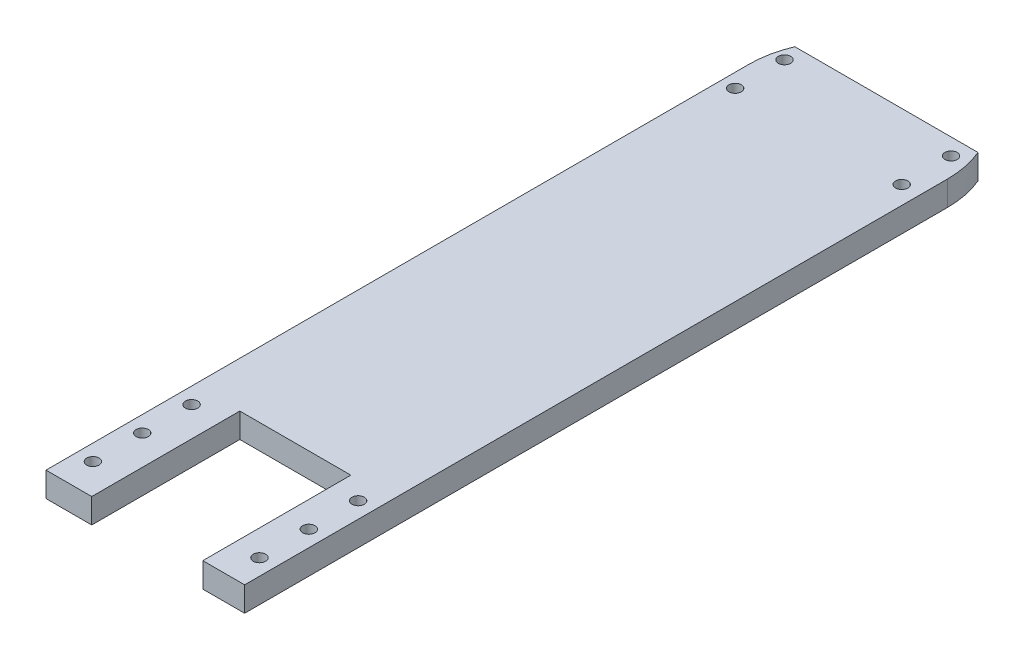
ISO-10303-21;
HEADER;
FILE_DESCRIPTION(('STEP AP214'),'2;1');
FILE_NAME('part.step','',(''),(''),'','','');
FILE_SCHEMA(('AUTOMOTIVE_DESIGN { 1 0 10303 214 1 1 1 1 }'));
ENDSEC;
DATA;
#1=APPLICATION_CONTEXT('core data for automotive mechanical design processes');
#2=APPLICATION_PROTOCOL_DEFINITION('international standard','automotive_design',2000,#1);
#3=PRODUCT_CONTEXT('',#1,'mechanical');
#4=PRODUCT('Part','Part','',(#3));
#5=PRODUCT_RELATED_PRODUCT_CATEGORY('part','',(#4));
#6=PRODUCT_DEFINITION_FORMATION('','',#4);
#7=PRODUCT_DEFINITION_CONTEXT('part definition',#1,'design');
#8=PRODUCT_DEFINITION('design','',#6,#7);
#9=PRODUCT_DEFINITION_SHAPE('','',#8);
#10=(LENGTH_UNIT() NAMED_UNIT(*) SI_UNIT(.MILLI.,.METRE.));
#11=(NAMED_UNIT(*) PLANE_ANGLE_UNIT() SI_UNIT($,.RADIAN.));
#12=(NAMED_UNIT(*) SI_UNIT($,.STERADIAN.) SOLID_ANGLE_UNIT());
#13=UNCERTAINTY_MEASURE_WITH_UNIT(LENGTH_MEASURE(1.E-05),#10,'distance_accuracy_value','');
#14=(GEOMETRIC_REPRESENTATION_CONTEXT(3) GLOBAL_UNCERTAINTY_ASSIGNED_CONTEXT((#13)) GLOBAL_UNIT_ASSIGNED_CONTEXT((#10,
#11,#12)) REPRESENTATION_CONTEXT('',''));
#15=CARTESIAN_POINT('',(0.,0.,0.));
#16=DIRECTION('',(0.,0.,1.));
#17=DIRECTION('',(1.,0.,0.));
#18=AXIS2_PLACEMENT_3D('',#15,#16,#17);
#19=CARTESIAN_POINT('',(-16.1,4.,113.9));
#20=DIRECTION('',(0.,0.,-1.));
#21=DIRECTION('',(-1.,0.,0.));
#22=AXIS2_PLACEMENT_3D('',#19,#20,#21);
#23=PLANE('',#22);
#24=DIRECTION('',(0.,1.,0.));
#25=VECTOR('',#24,1.);
#26=CARTESIAN_POINT('',(9.31602401074767,-6.,113.9));
#27=LINE('',#26,#25);
#28=CARTESIAN_POINT('',(9.31602401074767,0.,113.9));
#29=VERTEX_POINT('',#28);
#30=CARTESIAN_POINT('',(9.31602401074767,4.,113.9));
#31=VERTEX_POINT('',#30);
#32=EDGE_CURVE('E119',#29,#31,#27,.T.);
#33=ORIENTED_EDGE('',*,*,#32,.F.);
#34=DIRECTION('',(1.,0.,0.));
#35=VECTOR('',#34,1.);
#36=CARTESIAN_POINT('',(-16.1,0.,113.9));
#37=LINE('',#36,#35);
#38=CARTESIAN_POINT('',(16.1,0.,113.9));
#39=VERTEX_POINT('',#38);
#40=EDGE_CURVE('E223',#29,#39,#37,.T.);
#41=ORIENTED_EDGE('',*,*,#40,.T.);
#42=DIRECTION('',(0.,-1.,0.));
#43=VECTOR('',#42,1.);
#44=CARTESIAN_POINT('',(16.1,4.,113.9));
#45=LINE('',#44,#43);
#46=CARTESIAN_POINT('',(16.1,4.,113.9));
#47=VERTEX_POINT('',#46);
#48=EDGE_CURVE('E231',#47,#39,#45,.T.);
#49=ORIENTED_EDGE('',*,*,#48,.F.);
#50=DIRECTION('',(1.,0.,0.));
#51=VECTOR('',#50,1.);
#52=CARTESIAN_POINT('',(-16.1,4.,113.9));
#53=LINE('',#52,#51);
#54=EDGE_CURVE('E212',#31,#47,#53,.T.);
#55=ORIENTED_EDGE('',*,*,#54,.F.);
#56=EDGE_LOOP('',(#33,#41,#49,#55));
#57=FACE_BOUND('',#56,.T.);
#58=ADVANCED_FACE('F33',(#57),#23,.F.);
#59=DIRECTION('',(0.,1.,0.));
#60=VECTOR('',#59,1.);
#61=CARTESIAN_POINT('',(-8.68397598925233,-6.,113.9));
#62=LINE('',#61,#60);
#63=CARTESIAN_POINT('',(-8.68397598925233,0.,113.9));
#64=VERTEX_POINT('',#63);
#65=CARTESIAN_POINT('',(-8.68397598925233,4.,113.9));
#66=VERTEX_POINT('',#65);
#67=EDGE_CURVE('E48',#64,#66,#62,.T.);
#68=ORIENTED_EDGE('',*,*,#67,.T.);
#69=CARTESIAN_POINT('',(-16.1,4.,113.9));
#70=VERTEX_POINT('',#69);
#71=EDGE_CURVE('E213',#70,#66,#53,.T.);
#72=ORIENTED_EDGE('',*,*,#71,.F.);
#73=DIRECTION('',(0.,-1.,0.));
#74=VECTOR('',#73,1.);
#75=CARTESIAN_POINT('',(-16.1,4.,113.9));
#76=LINE('',#75,#74);
#77=CARTESIAN_POINT('',(-16.1,0.,113.9));
#78=VERTEX_POINT('',#77);
#79=EDGE_CURVE('E234',#70,#78,#76,.T.);
#80=ORIENTED_EDGE('',*,*,#79,.T.);
#81=EDGE_CURVE('E224',#78,#64,#37,.T.);
#82=ORIENTED_EDGE('',*,*,#81,.T.);
#83=EDGE_LOOP('',(#68,#72,#80,#82));
#84=FACE_BOUND('',#83,.T.);
#85=ADVANCED_FACE('F271',(#84),#23,.F.);
#86=CARTESIAN_POINT('',(0.,4.,0.));
#87=DIRECTION('',(0.,1.,0.));
#88=DIRECTION('',(0.,0.,1.));
#89=AXIS2_PLACEMENT_3D('',#86,#87,#88);
#90=PLANE('',#89);
#91=CARTESIAN_POINT('',(-13.8450945910286,4.,4.44848121337745));
#92=DIRECTION('',(0.,1.,0.));
#93=DIRECTION('',(0.,0.,1.));
#94=AXIS2_PLACEMENT_3D('',#91,#92,#93);
#95=CIRCLE('',#94,1.);
#96=CARTESIAN_POINT('',(-13.8450945910286,4.,5.44848121337745));
#97=VERTEX_POINT('',#96);
#98=EDGE_CURVE('E171',#97,#97,#95,.T.);
#99=ORIENTED_EDGE('',*,*,#98,.F.);
#100=EDGE_LOOP('',(#99));
#101=FACE_BOUND('',#100,.T.);
#102=CARTESIAN_POINT('',(-13.8450945910286,4.,-3.55151878662256));
#103=DIRECTION('',(0.,1.,0.));
#104=DIRECTION('',(0.,0.,1.));
#105=AXIS2_PLACEMENT_3D('',#102,#103,#104);
#106=CIRCLE('',#105,1.);
#107=CARTESIAN_POINT('',(-13.8450945910286,4.,-2.55151878662256));
#108=VERTEX_POINT('',#107);
#109=EDGE_CURVE('E165',#108,#108,#106,.T.);
#110=ORIENTED_EDGE('',*,*,#109,.F.);
#111=EDGE_LOOP('',(#110));
#112=FACE_BOUND('',#111,.T.);
#113=CARTESIAN_POINT('',(13.1549054089714,4.,4.44848121337745));
#114=DIRECTION('',(0.,1.,0.));
#115=DIRECTION('',(0.,0.,1.));
#116=AXIS2_PLACEMENT_3D('',#113,#114,#115);
#117=CIRCLE('',#116,1.00000000000001);
#118=CARTESIAN_POINT('',(13.1549054089714,4.,5.44848121337745));
#119=VERTEX_POINT('',#118);
#120=EDGE_CURVE('E159',#119,#119,#117,.T.);
#121=ORIENTED_EDGE('',*,*,#120,.F.);
#122=EDGE_LOOP('',(#121));
#123=FACE_BOUND('',#122,.T.);
#124=CARTESIAN_POINT('',(13.5,4.,108.9));
#125=DIRECTION('',(0.,1.,0.));
#126=DIRECTION('',(0.,0.,1.));
#127=AXIS2_PLACEMENT_3D('',#124,#125,#126);
#128=CIRCLE('',#127,1.);
#129=CARTESIAN_POINT('',(13.5,4.,109.9));
#130=VERTEX_POINT('',#129);
#131=EDGE_CURVE('E152',#130,#130,#128,.T.);
#132=ORIENTED_EDGE('',*,*,#131,.F.);
#133=EDGE_LOOP('',(#132));
#134=FACE_BOUND('',#133,.T.);
#135=CARTESIAN_POINT('',(13.5,4.,100.9));
#136=DIRECTION('',(0.,1.,0.));
#137=DIRECTION('',(0.,0.,1.));
#138=AXIS2_PLACEMENT_3D('',#135,#136,#137);
#139=CIRCLE('',#138,1.);
#140=CARTESIAN_POINT('',(13.5,4.,101.9));
#141=VERTEX_POINT('',#140);
#142=EDGE_CURVE('E195',#141,#141,#139,.T.);
#143=ORIENTED_EDGE('',*,*,#142,.F.);
#144=EDGE_LOOP('',(#143));
#145=FACE_BOUND('',#144,.T.);
#146=CARTESIAN_POINT('',(13.5,4.,92.9));
#147=DIRECTION('',(0.,1.,0.));
#148=DIRECTION('',(0.,0.,1.));
#149=AXIS2_PLACEMENT_3D('',#146,#147,#148);
#150=CIRCLE('',#149,1.);
#151=CARTESIAN_POINT('',(13.5,4.,93.9));
#152=VERTEX_POINT('',#151);
#153=EDGE_CURVE('E189',#152,#152,#150,.T.);
#154=ORIENTED_EDGE('',*,*,#153,.F.);
#155=EDGE_LOOP('',(#154));
#156=FACE_BOUND('',#155,.T.);
#157=CARTESIAN_POINT('',(-13.5,4.,92.9));
#158=DIRECTION('',(0.,1.,0.));
#159=DIRECTION('',(0.,0.,1.));
#160=AXIS2_PLACEMENT_3D('',#157,#158,#159);
#161=CIRCLE('',#160,1.);
#162=CARTESIAN_POINT('',(-13.5,4.,93.9));
#163=VERTEX_POINT('',#162);
#164=EDGE_CURVE('E183',#163,#163,#161,.T.);
#165=ORIENTED_EDGE('',*,*,#164,.F.);
#166=EDGE_LOOP('',(#165));
#167=FACE_BOUND('',#166,.T.);
#168=CARTESIAN_POINT('',(-13.5,4.,100.9));
#169=DIRECTION('',(0.,1.,0.));
#170=DIRECTION('',(0.,0.,1.));
#171=AXIS2_PLACEMENT_3D('',#168,#169,#170);
#172=CIRCLE('',#171,1.);
#173=CARTESIAN_POINT('',(-13.5,4.,101.9));
#174=VERTEX_POINT('',#173);
#175=EDGE_CURVE('E176',#174,#174,#172,.T.);
#176=ORIENTED_EDGE('',*,*,#175,.F.);
#177=EDGE_LOOP('',(#176));
#178=FACE_BOUND('',#177,.T.);
#179=CARTESIAN_POINT('',(13.1549054089714,4.,-3.55151878662256));
#180=DIRECTION('',(0.,1.,0.));
#181=DIRECTION('',(0.,0.,1.));
#182=AXIS2_PLACEMENT_3D('',#179,#180,#181);
#183=CIRCLE('',#182,1.00000000000001);
#184=CARTESIAN_POINT('',(13.1549054089714,4.,-2.55151878662255));
#185=VERTEX_POINT('',#184);
#186=EDGE_CURVE('E138',#185,#185,#183,.T.);
#187=ORIENTED_EDGE('',*,*,#186,.F.);
#188=EDGE_LOOP('',(#187));
#189=FACE_BOUND('',#188,.T.);
#190=CARTESIAN_POINT('',(-13.5,4.,108.9));
#191=DIRECTION('',(0.,1.,0.));
#192=DIRECTION('',(0.,0.,1.));
#193=AXIS2_PLACEMENT_3D('',#190,#191,#192);
#194=CIRCLE('',#193,1.);
#195=CARTESIAN_POINT('',(-13.5,4.,109.9));
#196=VERTEX_POINT('',#195);
#197=EDGE_CURVE('E179',#196,#196,#194,.T.);
#198=ORIENTED_EDGE('',*,*,#197,.F.);
#199=EDGE_LOOP('',(#198));
#200=FACE_BOUND('',#199,.T.);
#201=DIRECTION('',(1.,0.,0.));
#202=VECTOR('',#201,1.);
#203=CARTESIAN_POINT('',(-8.68397598925233,4.,89.9));
#204=LINE('',#203,#202);
#205=CARTESIAN_POINT('',(-8.68397598925233,4.,89.9));
#206=VERTEX_POINT('',#205);
#207=CARTESIAN_POINT('',(9.31602401074767,4.,89.9));
#208=VERTEX_POINT('',#207);
#209=EDGE_CURVE('E114',#206,#208,#204,.T.);
#210=ORIENTED_EDGE('',*,*,#209,.T.);
#211=DIRECTION('',(0.,0.,1.));
#212=VECTOR('',#211,1.);
#213=CARTESIAN_POINT('',(9.31602401074767,4.,89.9));
#214=LINE('',#213,#212);
#215=EDGE_CURVE('E122',#208,#31,#214,.T.);
#216=ORIENTED_EDGE('',*,*,#215,.T.);
#217=ORIENTED_EDGE('',*,*,#54,.T.);
#218=DIRECTION('',(0.,0.,-1.));
#219=VECTOR('',#218,1.);
#220=CARTESIAN_POINT('',(16.1,4.,113.9));
#221=LINE('',#220,#219);
#222=CARTESIAN_POINT('',(16.1,4.,0.));
#223=VERTEX_POINT('',#222);
#224=EDGE_CURVE('E215',#47,#223,#221,.T.);
#225=ORIENTED_EDGE('',*,*,#224,.T.);
#226=CARTESIAN_POINT('',(0.,4.,0.));
#227=DIRECTION('',(0.,1.,0.));
#228=DIRECTION('',(0.,0.,1.));
#229=AXIS2_PLACEMENT_3D('',#226,#227,#228);
#230=CIRCLE('',#229,16.1);
#231=CARTESIAN_POINT('',(14.8450945910286,4.,-6.23162631930167));
#232=VERTEX_POINT('',#231);
#233=EDGE_CURVE('E206',#223,#232,#230,.T.);
#234=ORIENTED_EDGE('',*,*,#233,.T.);
#235=DIRECTION('',(1.,0.,0.));
#236=VECTOR('',#235,1.);
#237=CARTESIAN_POINT('',(-14.8450945910286,4.,-6.23162631930167));
#238=LINE('',#237,#236);
#239=CARTESIAN_POINT('',(-14.8450945910286,4.,-6.23162631930167));
#240=VERTEX_POINT('',#239);
#241=EDGE_CURVE('E145',#240,#232,#238,.T.);
#242=ORIENTED_EDGE('',*,*,#241,.F.);
#243=CARTESIAN_POINT('',(-16.1,4.,0.));
#244=VERTEX_POINT('',#243);
#245=EDGE_CURVE('E210',#240,#244,#230,.T.);
#246=ORIENTED_EDGE('',*,*,#245,.T.);
#247=DIRECTION('',(0.,0.,1.));
#248=VECTOR('',#247,1.);
#249=CARTESIAN_POINT('',(-16.1,4.,0.));
#250=LINE('',#249,#248);
#251=EDGE_CURVE('E209',#244,#70,#250,.T.);
#252=ORIENTED_EDGE('',*,*,#251,.T.);
#253=ORIENTED_EDGE('',*,*,#71,.T.);
#254=DIRECTION('',(0.,0.,-1.));
#255=VECTOR('',#254,1.);
#256=CARTESIAN_POINT('',(-8.68397598925233,4.,113.9));
#257=LINE('',#256,#255);
#258=EDGE_CURVE('E127',#66,#206,#257,.T.);
#259=ORIENTED_EDGE('',*,*,#258,.T.);
#260=EDGE_LOOP('',(#210,#216,#217,#225,#234,#242,#246,#252,#253,#259));
#261=FACE_BOUND('',#260,.T.);
#262=ADVANCED_FACE('F129',(#101,#112,#123,#134,#145,#156,#167,#178,#189,#200,#261),#90,.T.);
#263=CARTESIAN_POINT('',(0.,0.,0.));
#264=DIRECTION('',(0.,1.,0.));
#265=DIRECTION('',(0.,0.,1.));
#266=AXIS2_PLACEMENT_3D('',#263,#264,#265);
#267=PLANE('',#266);
#268=CARTESIAN_POINT('',(-13.5,0.,108.9));
#269=DIRECTION('',(0.,1.,0.));
#270=DIRECTION('',(0.,0.,1.));
#271=AXIS2_PLACEMENT_3D('',#268,#269,#270);
#272=CIRCLE('',#271,1.);
#273=CARTESIAN_POINT('',(-13.5,0.,109.9));
#274=VERTEX_POINT('',#273);
#275=EDGE_CURVE('E200',#274,#274,#272,.T.);
#276=ORIENTED_EDGE('',*,*,#275,.T.);
#277=EDGE_LOOP('',(#276));
#278=FACE_BOUND('',#277,.T.);
#279=CARTESIAN_POINT('',(13.1549054089714,0.,-3.55151878662256));
#280=DIRECTION('',(0.,1.,0.));
#281=DIRECTION('',(0.,0.,1.));
#282=AXIS2_PLACEMENT_3D('',#279,#280,#281);
#283=CIRCLE('',#282,1.00000000000001);
#284=CARTESIAN_POINT('',(13.1549054089714,0.,-2.55151878662255));
#285=VERTEX_POINT('',#284);
#286=EDGE_CURVE('E142',#285,#285,#283,.T.);
#287=ORIENTED_EDGE('',*,*,#286,.T.);
#288=EDGE_LOOP('',(#287));
#289=FACE_BOUND('',#288,.T.);
#290=CARTESIAN_POINT('',(-13.5,0.,100.9));
#291=DIRECTION('',(0.,1.,0.));
#292=DIRECTION('',(0.,0.,1.));
#293=AXIS2_PLACEMENT_3D('',#290,#291,#292);
#294=CIRCLE('',#293,1.);
#295=CARTESIAN_POINT('',(-13.5,0.,101.9));
#296=VERTEX_POINT('',#295);
#297=EDGE_CURVE('E180',#296,#296,#294,.T.);
#298=ORIENTED_EDGE('',*,*,#297,.T.);
#299=EDGE_LOOP('',(#298));
#300=FACE_BOUND('',#299,.T.);
#301=CARTESIAN_POINT('',(-13.5,0.,92.9));
#302=DIRECTION('',(0.,1.,0.));
#303=DIRECTION('',(0.,0.,1.));
#304=AXIS2_PLACEMENT_3D('',#301,#302,#303);
#305=CIRCLE('',#304,1.);
#306=CARTESIAN_POINT('',(-13.5,0.,93.9));
#307=VERTEX_POINT('',#306);
#308=EDGE_CURVE('E186',#307,#307,#305,.T.);
#309=ORIENTED_EDGE('',*,*,#308,.T.);
#310=EDGE_LOOP('',(#309));
#311=FACE_BOUND('',#310,.T.);
#312=CARTESIAN_POINT('',(13.5,0.,92.9));
#313=DIRECTION('',(0.,1.,0.));
#314=DIRECTION('',(0.,0.,1.));
#315=AXIS2_PLACEMENT_3D('',#312,#313,#314);
#316=CIRCLE('',#315,1.);
#317=CARTESIAN_POINT('',(13.5,0.,93.9));
#318=VERTEX_POINT('',#317);
#319=EDGE_CURVE('E192',#318,#318,#316,.T.);
#320=ORIENTED_EDGE('',*,*,#319,.T.);
#321=EDGE_LOOP('',(#320));
#322=FACE_BOUND('',#321,.T.);
#323=CARTESIAN_POINT('',(13.5,0.,100.9));
#324=DIRECTION('',(0.,1.,0.));
#325=DIRECTION('',(0.,0.,1.));
#326=AXIS2_PLACEMENT_3D('',#323,#324,#325);
#327=CIRCLE('',#326,1.);
#328=CARTESIAN_POINT('',(13.5,0.,101.9));
#329=VERTEX_POINT('',#328);
#330=EDGE_CURVE('E155',#329,#329,#327,.T.);
#331=ORIENTED_EDGE('',*,*,#330,.T.);
#332=EDGE_LOOP('',(#331));
#333=FACE_BOUND('',#332,.T.);
#334=CARTESIAN_POINT('',(13.5,0.,108.9));
#335=DIRECTION('',(0.,1.,0.));
#336=DIRECTION('',(0.,0.,1.));
#337=AXIS2_PLACEMENT_3D('',#334,#335,#336);
#338=CIRCLE('',#337,1.);
#339=CARTESIAN_POINT('',(13.5,0.,109.9));
#340=VERTEX_POINT('',#339);
#341=EDGE_CURVE('E156',#340,#340,#338,.T.);
#342=ORIENTED_EDGE('',*,*,#341,.T.);
#343=EDGE_LOOP('',(#342));
#344=FACE_BOUND('',#343,.T.);
#345=CARTESIAN_POINT('',(13.1549054089714,0.,4.44848121337745));
#346=DIRECTION('',(0.,1.,0.));
#347=DIRECTION('',(0.,0.,1.));
#348=AXIS2_PLACEMENT_3D('',#345,#346,#347);
#349=CIRCLE('',#348,1.00000000000001);
#350=CARTESIAN_POINT('',(13.1549054089714,0.,5.44848121337745));
#351=VERTEX_POINT('',#350);
#352=EDGE_CURVE('E162',#351,#351,#349,.T.);
#353=ORIENTED_EDGE('',*,*,#352,.T.);
#354=EDGE_LOOP('',(#353));
#355=FACE_BOUND('',#354,.T.);
#356=CARTESIAN_POINT('',(-13.8450945910286,0.,-3.55151878662256));
#357=DIRECTION('',(0.,1.,0.));
#358=DIRECTION('',(0.,0.,1.));
#359=AXIS2_PLACEMENT_3D('',#356,#357,#358);
#360=CIRCLE('',#359,1.);
#361=CARTESIAN_POINT('',(-13.8450945910286,0.,-2.55151878662256));
#362=VERTEX_POINT('',#361);
#363=EDGE_CURVE('E168',#362,#362,#360,.T.);
#364=ORIENTED_EDGE('',*,*,#363,.T.);
#365=EDGE_LOOP('',(#364));
#366=FACE_BOUND('',#365,.T.);
#367=CARTESIAN_POINT('',(-13.8450945910286,0.,4.44848121337745));
#368=DIRECTION('',(0.,1.,0.));
#369=DIRECTION('',(0.,0.,1.));
#370=AXIS2_PLACEMENT_3D('',#367,#368,#369);
#371=CIRCLE('',#370,1.);
#372=CARTESIAN_POINT('',(-13.8450945910286,0.,5.44848121337745));
#373=VERTEX_POINT('',#372);
#374=EDGE_CURVE('E141',#373,#373,#371,.T.);
#375=ORIENTED_EDGE('',*,*,#374,.T.);
#376=EDGE_LOOP('',(#375));
#377=FACE_BOUND('',#376,.T.);
#378=DIRECTION('',(0.,0.,1.));
#379=VECTOR('',#378,1.);
#380=CARTESIAN_POINT('',(9.31602401074767,0.,0.));
#381=LINE('',#380,#379);
#382=CARTESIAN_POINT('',(9.31602401074767,0.,89.9));
#383=VERTEX_POINT('',#382);
#384=EDGE_CURVE('E11',#383,#29,#381,.T.);
#385=ORIENTED_EDGE('',*,*,#384,.F.);
#386=DIRECTION('',(1.,0.,0.));
#387=VECTOR('',#386,1.);
#388=CARTESIAN_POINT('',(0.,0.,89.9));
#389=LINE('',#388,#387);
#390=CARTESIAN_POINT('',(-8.68397598925233,0.,89.9));
#391=VERTEX_POINT('',#390);
#392=EDGE_CURVE('E41',#391,#383,#389,.T.);
#393=ORIENTED_EDGE('',*,*,#392,.F.);
#394=DIRECTION('',(0.,0.,-1.));
#395=VECTOR('',#394,1.);
#396=CARTESIAN_POINT('',(-8.68397598925233,0.,0.));
#397=LINE('',#396,#395);
#398=EDGE_CURVE('E240',#64,#391,#397,.T.);
#399=ORIENTED_EDGE('',*,*,#398,.F.);
#400=ORIENTED_EDGE('',*,*,#81,.F.);
#401=DIRECTION('',(0.,0.,1.));
#402=VECTOR('',#401,1.);
#403=CARTESIAN_POINT('',(-16.1,0.,0.));
#404=LINE('',#403,#402);
#405=CARTESIAN_POINT('',(-16.1,0.,0.));
#406=VERTEX_POINT('',#405);
#407=EDGE_CURVE('E221',#406,#78,#404,.T.);
#408=ORIENTED_EDGE('',*,*,#407,.F.);
#409=CARTESIAN_POINT('',(0.,0.,0.));
#410=DIRECTION('',(0.,1.,0.));
#411=DIRECTION('',(0.,0.,1.));
#412=AXIS2_PLACEMENT_3D('',#409,#410,#411);
#413=CIRCLE('',#412,16.1);
#414=CARTESIAN_POINT('',(-14.8450945910286,0.,-6.23162631930167));
#415=VERTEX_POINT('',#414);
#416=EDGE_CURVE('E203',#415,#406,#413,.T.);
#417=ORIENTED_EDGE('',*,*,#416,.F.);
#418=DIRECTION('',(1.,0.,0.));
#419=VECTOR('',#418,1.);
#420=CARTESIAN_POINT('',(-14.8450945910286,0.,-6.23162631930167));
#421=LINE('',#420,#419);
#422=CARTESIAN_POINT('',(14.8450945910286,0.,-6.23162631930167));
#423=VERTEX_POINT('',#422);
#424=EDGE_CURVE('E148',#415,#423,#421,.T.);
#425=ORIENTED_EDGE('',*,*,#424,.T.);
#426=CARTESIAN_POINT('',(16.1,0.,0.));
#427=VERTEX_POINT('',#426);
#428=EDGE_CURVE('E218',#427,#423,#413,.T.);
#429=ORIENTED_EDGE('',*,*,#428,.F.);
#430=DIRECTION('',(0.,0.,-1.));
#431=VECTOR('',#430,1.);
#432=CARTESIAN_POINT('',(16.1,0.,113.9));
#433=LINE('',#432,#431);
#434=EDGE_CURVE('E227',#39,#427,#433,.T.);
#435=ORIENTED_EDGE('',*,*,#434,.F.);
#436=ORIENTED_EDGE('',*,*,#40,.F.);
#437=EDGE_LOOP('',(#385,#393,#399,#400,#408,#417,#425,#429,#435,#436));
#438=FACE_BOUND('',#437,.T.);
#439=ADVANCED_FACE('F244',(#278,#289,#300,#311,#322,#333,#344,#355,#366,#377,#438),#267,.F.);
#440=CARTESIAN_POINT('',(0.,4.,0.));
#441=DIRECTION('',(0.,-1.,0.));
#442=DIRECTION('',(0.,0.,-1.));
#443=AXIS2_PLACEMENT_3D('',#440,#441,#442);
#444=CYLINDRICAL_SURFACE('',#443,16.1);
#445=ORIENTED_EDGE('',*,*,#245,.F.);
#446=DIRECTION('',(0.,1.,0.));
#447=VECTOR('',#446,1.);
#448=CARTESIAN_POINT('',(-14.8450945910286,0.,-6.23162631930167));
#449=LINE('',#448,#447);
#450=EDGE_CURVE('E146',#415,#240,#449,.T.);
#451=ORIENTED_EDGE('',*,*,#450,.F.);
#452=ORIENTED_EDGE('',*,*,#416,.T.);
#453=DIRECTION('',(0.,-1.,0.));
#454=VECTOR('',#453,1.);
#455=CARTESIAN_POINT('',(-16.1,4.,0.));
#456=LINE('',#455,#454);
#457=EDGE_CURVE('E237',#244,#406,#456,.T.);
#458=ORIENTED_EDGE('',*,*,#457,.F.);
#459=EDGE_LOOP('',(#445,#451,#452,#458));
#460=FACE_BOUND('',#459,.T.);
#461=ADVANCED_FACE('F263',(#460),#444,.T.);
#462=ORIENTED_EDGE('',*,*,#428,.T.);
#463=DIRECTION('',(0.,1.,0.));
#464=VECTOR('',#463,1.);
#465=CARTESIAN_POINT('',(14.8450945910286,0.,-6.23162631930167));
#466=LINE('',#465,#464);
#467=EDGE_CURVE('E56',#423,#232,#466,.T.);
#468=ORIENTED_EDGE('',*,*,#467,.T.);
#469=ORIENTED_EDGE('',*,*,#233,.F.);
#470=DIRECTION('',(0.,-1.,0.));
#471=VECTOR('',#470,1.);
#472=CARTESIAN_POINT('',(16.1,4.,0.));
#473=LINE('',#472,#471);
#474=EDGE_CURVE('E217',#223,#427,#473,.T.);
#475=ORIENTED_EDGE('',*,*,#474,.T.);
#476=EDGE_LOOP('',(#462,#468,#469,#475));
#477=FACE_BOUND('',#476,.T.);
#478=ADVANCED_FACE('F35',(#477),#444,.T.);
#479=CARTESIAN_POINT('',(-16.1,4.,0.));
#480=DIRECTION('',(1.,0.,0.));
#481=DIRECTION('',(0.,0.,-1.));
#482=AXIS2_PLACEMENT_3D('',#479,#480,#481);
#483=PLANE('',#482);
#484=ORIENTED_EDGE('',*,*,#407,.T.);
#485=ORIENTED_EDGE('',*,*,#79,.F.);
#486=ORIENTED_EDGE('',*,*,#251,.F.);
#487=ORIENTED_EDGE('',*,*,#457,.T.);
#488=EDGE_LOOP('',(#484,#485,#486,#487));
#489=FACE_BOUND('',#488,.T.);
#490=ADVANCED_FACE('F268',(#489),#483,.F.);
#491=CARTESIAN_POINT('',(16.1,4.,113.9));
#492=DIRECTION('',(-1.,0.,0.));
#493=DIRECTION('',(0.,0.,1.));
#494=AXIS2_PLACEMENT_3D('',#491,#492,#493);
#495=PLANE('',#494);
#496=ORIENTED_EDGE('',*,*,#434,.T.);
#497=ORIENTED_EDGE('',*,*,#474,.F.);
#498=ORIENTED_EDGE('',*,*,#224,.F.);
#499=ORIENTED_EDGE('',*,*,#48,.T.);
#500=EDGE_LOOP('',(#496,#497,#498,#499));
#501=FACE_BOUND('',#500,.T.);
#502=ADVANCED_FACE('F254',(#501),#495,.F.);
#503=CARTESIAN_POINT('',(-13.5,0.,108.9));
#504=DIRECTION('',(0.,1.,0.));
#505=DIRECTION('',(0.,0.,1.));
#506=AXIS2_PLACEMENT_3D('',#503,#504,#505);
#507=CYLINDRICAL_SURFACE('',#506,1.);
#508=ORIENTED_EDGE('',*,*,#275,.F.);
#509=EDGE_LOOP('',(#508));
#510=FACE_BOUND('',#509,.T.);
#511=ORIENTED_EDGE('',*,*,#197,.T.);
#512=EDGE_LOOP('',(#511));
#513=FACE_BOUND('',#512,.T.);
#514=ADVANCED_FACE('F287',(#510,#513),#507,.F.);
#515=CARTESIAN_POINT('',(-14.8450945910286,0.,-6.23162631930167));
#516=DIRECTION('',(0.,0.,1.));
#517=DIRECTION('',(1.,0.,0.));
#518=AXIS2_PLACEMENT_3D('',#515,#516,#517);
#519=PLANE('',#518);
#520=ORIENTED_EDGE('',*,*,#241,.T.);
#521=ORIENTED_EDGE('',*,*,#467,.F.);
#522=ORIENTED_EDGE('',*,*,#424,.F.);
#523=ORIENTED_EDGE('',*,*,#450,.T.);
#524=EDGE_LOOP('',(#520,#521,#522,#523));
#525=FACE_BOUND('',#524,.T.);
#526=ADVANCED_FACE('F260',(#525),#519,.F.);
#527=CARTESIAN_POINT('',(13.1549054089714,0.,-3.55151878662256));
#528=DIRECTION('',(0.,1.,0.));
#529=DIRECTION('',(0.,0.,1.));
#530=AXIS2_PLACEMENT_3D('',#527,#528,#529);
#531=CYLINDRICAL_SURFACE('',#530,1.00000000000001);
#532=ORIENTED_EDGE('',*,*,#286,.F.);
#533=EDGE_LOOP('',(#532));
#534=FACE_BOUND('',#533,.T.);
#535=ORIENTED_EDGE('',*,*,#186,.T.);
#536=EDGE_LOOP('',(#535));
#537=FACE_BOUND('',#536,.T.);
#538=ADVANCED_FACE('F318',(#534,#537),#531,.F.);
#539=CARTESIAN_POINT('',(-13.5,0.,100.9));
#540=DIRECTION('',(0.,1.,0.));
#541=DIRECTION('',(0.,0.,1.));
#542=AXIS2_PLACEMENT_3D('',#539,#540,#541);
#543=CYLINDRICAL_SURFACE('',#542,1.);
#544=ORIENTED_EDGE('',*,*,#297,.F.);
#545=EDGE_LOOP('',(#544));
#546=FACE_BOUND('',#545,.T.);
#547=ORIENTED_EDGE('',*,*,#175,.T.);
#548=EDGE_LOOP('',(#547));
#549=FACE_BOUND('',#548,.T.);
#550=ADVANCED_FACE('F314',(#546,#549),#543,.F.);
#551=CARTESIAN_POINT('',(-13.5,0.,92.9));
#552=DIRECTION('',(0.,1.,0.));
#553=DIRECTION('',(0.,0.,1.));
#554=AXIS2_PLACEMENT_3D('',#551,#552,#553);
#555=CYLINDRICAL_SURFACE('',#554,1.);
#556=ORIENTED_EDGE('',*,*,#308,.F.);
#557=EDGE_LOOP('',(#556));
#558=FACE_BOUND('',#557,.T.);
#559=ORIENTED_EDGE('',*,*,#164,.T.);
#560=EDGE_LOOP('',(#559));
#561=FACE_BOUND('',#560,.T.);
#562=ADVANCED_FACE('F310',(#558,#561),#555,.F.);
#563=CARTESIAN_POINT('',(13.5,0.,92.9));
#564=DIRECTION('',(0.,1.,0.));
#565=DIRECTION('',(0.,0.,1.));
#566=AXIS2_PLACEMENT_3D('',#563,#564,#565);
#567=CYLINDRICAL_SURFACE('',#566,1.);
#568=ORIENTED_EDGE('',*,*,#319,.F.);
#569=EDGE_LOOP('',(#568));
#570=FACE_BOUND('',#569,.T.);
#571=ORIENTED_EDGE('',*,*,#153,.T.);
#572=EDGE_LOOP('',(#571));
#573=FACE_BOUND('',#572,.T.);
#574=ADVANCED_FACE('F306',(#570,#573),#567,.F.);
#575=CARTESIAN_POINT('',(13.5,0.,100.9));
#576=DIRECTION('',(0.,1.,0.));
#577=DIRECTION('',(0.,0.,1.));
#578=AXIS2_PLACEMENT_3D('',#575,#576,#577);
#579=CYLINDRICAL_SURFACE('',#578,1.);
#580=ORIENTED_EDGE('',*,*,#330,.F.);
#581=EDGE_LOOP('',(#580));
#582=FACE_BOUND('',#581,.T.);
#583=ORIENTED_EDGE('',*,*,#142,.T.);
#584=EDGE_LOOP('',(#583));
#585=FACE_BOUND('',#584,.T.);
#586=ADVANCED_FACE('F302',(#582,#585),#579,.F.);
#587=CARTESIAN_POINT('',(13.5,0.,108.9));
#588=DIRECTION('',(0.,1.,0.));
#589=DIRECTION('',(0.,0.,1.));
#590=AXIS2_PLACEMENT_3D('',#587,#588,#589);
#591=CYLINDRICAL_SURFACE('',#590,1.);
#592=ORIENTED_EDGE('',*,*,#341,.F.);
#593=EDGE_LOOP('',(#592));
#594=FACE_BOUND('',#593,.T.);
#595=ORIENTED_EDGE('',*,*,#131,.T.);
#596=EDGE_LOOP('',(#595));
#597=FACE_BOUND('',#596,.T.);
#598=ADVANCED_FACE('F305',(#594,#597),#591,.F.);
#599=CARTESIAN_POINT('',(13.1549054089714,0.,4.44848121337745));
#600=DIRECTION('',(0.,1.,0.));
#601=DIRECTION('',(0.,0.,1.));
#602=AXIS2_PLACEMENT_3D('',#599,#600,#601);
#603=CYLINDRICAL_SURFACE('',#602,1.00000000000001);
#604=ORIENTED_EDGE('',*,*,#352,.F.);
#605=EDGE_LOOP('',(#604));
#606=FACE_BOUND('',#605,.T.);
#607=ORIENTED_EDGE('',*,*,#120,.T.);
#608=EDGE_LOOP('',(#607));
#609=FACE_BOUND('',#608,.T.);
#610=ADVANCED_FACE('F327',(#606,#609),#603,.F.);
#611=CARTESIAN_POINT('',(-13.8450945910286,0.,-3.55151878662256));
#612=DIRECTION('',(0.,1.,0.));
#613=DIRECTION('',(0.,0.,1.));
#614=AXIS2_PLACEMENT_3D('',#611,#612,#613);
#615=CYLINDRICAL_SURFACE('',#614,1.);
#616=ORIENTED_EDGE('',*,*,#363,.F.);
#617=EDGE_LOOP('',(#616));
#618=FACE_BOUND('',#617,.T.);
#619=ORIENTED_EDGE('',*,*,#109,.T.);
#620=EDGE_LOOP('',(#619));
#621=FACE_BOUND('',#620,.T.);
#622=ADVANCED_FACE('F323',(#618,#621),#615,.F.);
#623=CARTESIAN_POINT('',(-13.8450945910286,0.,4.44848121337745));
#624=DIRECTION('',(0.,1.,0.));
#625=DIRECTION('',(0.,0.,1.));
#626=AXIS2_PLACEMENT_3D('',#623,#624,#625);
#627=CYLINDRICAL_SURFACE('',#626,1.);
#628=ORIENTED_EDGE('',*,*,#374,.F.);
#629=EDGE_LOOP('',(#628));
#630=FACE_BOUND('',#629,.T.);
#631=ORIENTED_EDGE('',*,*,#98,.T.);
#632=EDGE_LOOP('',(#631));
#633=FACE_BOUND('',#632,.T.);
#634=ADVANCED_FACE('F320',(#630,#633),#627,.F.);
#635=CARTESIAN_POINT('',(-8.68397598925233,-6.,89.9));
#636=DIRECTION('',(0.,0.,1.));
#637=DIRECTION('',(1.,0.,0.));
#638=AXIS2_PLACEMENT_3D('',#635,#636,#637);
#639=PLANE('',#638);
#640=ORIENTED_EDGE('',*,*,#392,.T.);
#641=DIRECTION('',(0.,1.,0.));
#642=VECTOR('',#641,1.);
#643=CARTESIAN_POINT('',(9.31602401074767,-6.,89.9));
#644=LINE('',#643,#642);
#645=EDGE_CURVE('E109',#383,#208,#644,.T.);
#646=ORIENTED_EDGE('',*,*,#645,.T.);
#647=ORIENTED_EDGE('',*,*,#209,.F.);
#648=DIRECTION('',(0.,1.,0.));
#649=VECTOR('',#648,1.);
#650=CARTESIAN_POINT('',(-8.68397598925233,-6.,89.9));
#651=LINE('',#650,#649);
#652=EDGE_CURVE('E134',#391,#206,#651,.T.);
#653=ORIENTED_EDGE('',*,*,#652,.F.);
#654=EDGE_LOOP('',(#640,#646,#647,#653));
#655=FACE_BOUND('',#654,.T.);
#656=ADVANCED_FACE('F111',(#655),#639,.T.);
#657=CARTESIAN_POINT('',(9.31602401074767,-6.,89.9));
#658=DIRECTION('',(-1.,0.,0.));
#659=DIRECTION('',(0.,0.,1.));
#660=AXIS2_PLACEMENT_3D('',#657,#658,#659);
#661=PLANE('',#660);
#662=ORIENTED_EDGE('',*,*,#384,.T.);
#663=ORIENTED_EDGE('',*,*,#32,.T.);
#664=ORIENTED_EDGE('',*,*,#215,.F.);
#665=ORIENTED_EDGE('',*,*,#645,.F.);
#666=EDGE_LOOP('',(#662,#663,#664,#665));
#667=FACE_BOUND('',#666,.T.);
#668=ADVANCED_FACE('F123',(#667),#661,.T.);
#669=CARTESIAN_POINT('',(-8.68397598925233,-6.,113.9));
#670=DIRECTION('',(1.,0.,0.));
#671=DIRECTION('',(0.,0.,-1.));
#672=AXIS2_PLACEMENT_3D('',#669,#670,#671);
#673=PLANE('',#672);
#674=ORIENTED_EDGE('',*,*,#398,.T.);
#675=ORIENTED_EDGE('',*,*,#652,.T.);
#676=ORIENTED_EDGE('',*,*,#258,.F.);
#677=ORIENTED_EDGE('',*,*,#67,.F.);
#678=EDGE_LOOP('',(#674,#675,#676,#677));
#679=FACE_BOUND('',#678,.T.);
#680=ADVANCED_FACE('F241',(#679),#673,.T.);
#681=CLOSED_SHELL('',(#58,#85,#262,#439,#461,#478,#490,#502,#514,#526,#538,#550,#562,#574,#586,
#598,#610,#622,#634,#656,#668,#680));
#682=MANIFOLD_SOLID_BREP('B2',#681);
#683=ADVANCED_BREP_SHAPE_REPRESENTATION('',(#18,#682),#14);
#684=SHAPE_DEFINITION_REPRESENTATION(#9,#683);
ENDSEC;
END-ISO-10303-21;
